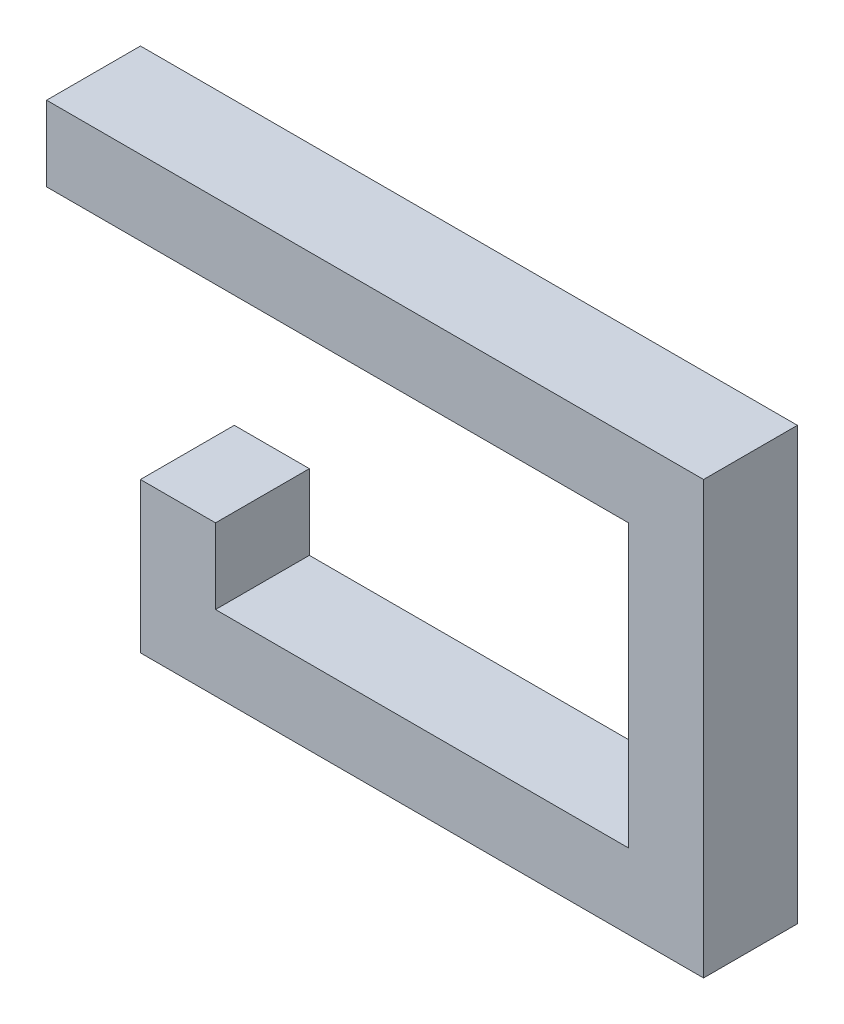
ISO-10303-21;
HEADER;
FILE_DESCRIPTION(('STEP AP214'),'2;1');
FILE_NAME('part.step','',(''),(''),'','','');
FILE_SCHEMA(('AUTOMOTIVE_DESIGN { 1 0 10303 214 1 1 1 1 }'));
ENDSEC;
DATA;
#1=APPLICATION_CONTEXT('core data for automotive mechanical design processes');
#2=APPLICATION_PROTOCOL_DEFINITION('international standard','automotive_design',2000,#1);
#3=PRODUCT_CONTEXT('',#1,'mechanical');
#4=PRODUCT('Part','Part','',(#3));
#5=PRODUCT_RELATED_PRODUCT_CATEGORY('part','',(#4));
#6=PRODUCT_DEFINITION_FORMATION('','',#4);
#7=PRODUCT_DEFINITION_CONTEXT('part definition',#1,'design');
#8=PRODUCT_DEFINITION('design','',#6,#7);
#9=PRODUCT_DEFINITION_SHAPE('','',#8);
#10=(LENGTH_UNIT() NAMED_UNIT(*) SI_UNIT(.MILLI.,.METRE.));
#11=(NAMED_UNIT(*) PLANE_ANGLE_UNIT() SI_UNIT($,.RADIAN.));
#12=(NAMED_UNIT(*) SI_UNIT($,.STERADIAN.) SOLID_ANGLE_UNIT());
#13=UNCERTAINTY_MEASURE_WITH_UNIT(LENGTH_MEASURE(1.E-05),#10,'distance_accuracy_value','');
#14=(GEOMETRIC_REPRESENTATION_CONTEXT(3) GLOBAL_UNCERTAINTY_ASSIGNED_CONTEXT((#13)) GLOBAL_UNIT_ASSIGNED_CONTEXT((#10,
#11,#12)) REPRESENTATION_CONTEXT('',''));
#15=CARTESIAN_POINT('',(0.,0.,0.));
#16=DIRECTION('',(0.,0.,1.));
#17=DIRECTION('',(1.,0.,0.));
#18=AXIS2_PLACEMENT_3D('',#15,#16,#17);
#19=CARTESIAN_POINT('',(0.,0.,2.5));
#20=DIRECTION('',(0.,1.,0.));
#21=DIRECTION('',(0.,0.,1.));
#22=AXIS2_PLACEMENT_3D('',#19,#20,#21);
#23=PLANE('',#22);
#24=DIRECTION('',(1.,0.,0.));
#25=VECTOR('',#24,1.);
#26=CARTESIAN_POINT('',(0.,0.,0.));
#27=LINE('',#26,#25);
#28=CARTESIAN_POINT('',(0.,0.,0.));
#29=VERTEX_POINT('',#28);
#30=CARTESIAN_POINT('',(15.,0.,0.));
#31=VERTEX_POINT('',#30);
#32=EDGE_CURVE('E156',#29,#31,#27,.T.);
#33=ORIENTED_EDGE('',*,*,#32,.T.);
#34=DIRECTION('',(0.,0.,-1.));
#35=VECTOR('',#34,1.);
#36=CARTESIAN_POINT('',(15.,0.,2.5));
#37=LINE('',#36,#35);
#38=CARTESIAN_POINT('',(15.,0.,2.5));
#39=VERTEX_POINT('',#38);
#40=EDGE_CURVE('E48',#39,#31,#37,.T.);
#41=ORIENTED_EDGE('',*,*,#40,.F.);
#42=DIRECTION('',(1.,0.,0.));
#43=VECTOR('',#42,1.);
#44=CARTESIAN_POINT('',(0.,0.,2.5));
#45=LINE('',#44,#43);
#46=CARTESIAN_POINT('',(0.,0.,2.5));
#47=VERTEX_POINT('',#46);
#48=EDGE_CURVE('E106',#47,#39,#45,.T.);
#49=ORIENTED_EDGE('',*,*,#48,.F.);
#50=DIRECTION('',(0.,0.,-1.));
#51=VECTOR('',#50,1.);
#52=CARTESIAN_POINT('',(0.,0.,2.5));
#53=LINE('',#52,#51);
#54=EDGE_CURVE('E11',#47,#29,#53,.T.);
#55=ORIENTED_EDGE('',*,*,#54,.T.);
#56=EDGE_LOOP('',(#33,#41,#49,#55));
#57=FACE_BOUND('',#56,.T.);
#58=ADVANCED_FACE('F39',(#57),#23,.F.);
#59=CARTESIAN_POINT('',(15.,0.,2.5));
#60=DIRECTION('',(-1.,0.,0.));
#61=DIRECTION('',(0.,0.,1.));
#62=AXIS2_PLACEMENT_3D('',#59,#60,#61);
#63=PLANE('',#62);
#64=DIRECTION('',(0.,1.,0.));
#65=VECTOR('',#64,1.);
#66=CARTESIAN_POINT('',(15.,0.,0.));
#67=LINE('',#66,#65);
#68=CARTESIAN_POINT('',(15.,11.5,0.));
#69=VERTEX_POINT('',#68);
#70=EDGE_CURVE('E159',#31,#69,#67,.T.);
#71=ORIENTED_EDGE('',*,*,#70,.T.);
#72=DIRECTION('',(0.,0.,-1.));
#73=VECTOR('',#72,1.);
#74=CARTESIAN_POINT('',(15.,11.5,2.5));
#75=LINE('',#74,#73);
#76=CARTESIAN_POINT('',(15.,11.5,2.5));
#77=VERTEX_POINT('',#76);
#78=EDGE_CURVE('E201',#77,#69,#75,.T.);
#79=ORIENTED_EDGE('',*,*,#78,.F.);
#80=DIRECTION('',(0.,1.,0.));
#81=VECTOR('',#80,1.);
#82=CARTESIAN_POINT('',(15.,0.,2.5));
#83=LINE('',#82,#81);
#84=EDGE_CURVE('E211',#39,#77,#83,.T.);
#85=ORIENTED_EDGE('',*,*,#84,.F.);
#86=ORIENTED_EDGE('',*,*,#40,.T.);
#87=EDGE_LOOP('',(#71,#79,#85,#86));
#88=FACE_BOUND('',#87,.T.);
#89=ADVANCED_FACE('F209',(#88),#63,.F.);
#90=CARTESIAN_POINT('',(15.,11.5,2.5));
#91=DIRECTION('',(0.,-1.,0.));
#92=DIRECTION('',(1.,0.,0.));
#93=AXIS2_PLACEMENT_3D('',#90,#91,#92);
#94=PLANE('',#93);
#95=DIRECTION('',(-1.,0.,0.));
#96=VECTOR('',#95,1.);
#97=CARTESIAN_POINT('',(15.,11.5,0.));
#98=LINE('',#97,#96);
#99=CARTESIAN_POINT('',(-2.5,11.5,0.));
#100=VERTEX_POINT('',#99);
#101=EDGE_CURVE('E162',#69,#100,#98,.T.);
#102=ORIENTED_EDGE('',*,*,#101,.T.);
#103=DIRECTION('',(0.,0.,-1.));
#104=VECTOR('',#103,1.);
#105=CARTESIAN_POINT('',(-2.5,11.5,2.5));
#106=LINE('',#105,#104);
#107=CARTESIAN_POINT('',(-2.5,11.5,2.5));
#108=VERTEX_POINT('',#107);
#109=EDGE_CURVE('E197',#108,#100,#106,.T.);
#110=ORIENTED_EDGE('',*,*,#109,.F.);
#111=DIRECTION('',(-1.,0.,0.));
#112=VECTOR('',#111,1.);
#113=CARTESIAN_POINT('',(15.,11.5,2.5));
#114=LINE('',#113,#112);
#115=EDGE_CURVE('E231',#77,#108,#114,.T.);
#116=ORIENTED_EDGE('',*,*,#115,.F.);
#117=ORIENTED_EDGE('',*,*,#78,.T.);
#118=EDGE_LOOP('',(#102,#110,#116,#117));
#119=FACE_BOUND('',#118,.T.);
#120=ADVANCED_FACE('F221',(#119),#94,.F.);
#121=CARTESIAN_POINT('',(-2.5,11.5,2.5));
#122=DIRECTION('',(1.,0.,0.));
#123=DIRECTION('',(0.,1.,0.));
#124=AXIS2_PLACEMENT_3D('',#121,#122,#123);
#125=PLANE('',#124);
#126=DIRECTION('',(0.,-1.,0.));
#127=VECTOR('',#126,1.);
#128=CARTESIAN_POINT('',(-2.5,11.5,0.));
#129=LINE('',#128,#127);
#130=CARTESIAN_POINT('',(-2.5,9.5,0.));
#131=VERTEX_POINT('',#130);
#132=EDGE_CURVE('E165',#100,#131,#129,.T.);
#133=ORIENTED_EDGE('',*,*,#132,.T.);
#134=DIRECTION('',(0.,0.,-1.));
#135=VECTOR('',#134,1.);
#136=CARTESIAN_POINT('',(-2.5,9.5,2.5));
#137=LINE('',#136,#135);
#138=CARTESIAN_POINT('',(-2.5,9.5,2.5));
#139=VERTEX_POINT('',#138);
#140=EDGE_CURVE('E193',#139,#131,#137,.T.);
#141=ORIENTED_EDGE('',*,*,#140,.F.);
#142=DIRECTION('',(0.,-1.,0.));
#143=VECTOR('',#142,1.);
#144=CARTESIAN_POINT('',(-2.5,11.5,2.5));
#145=LINE('',#144,#143);
#146=EDGE_CURVE('E227',#108,#139,#145,.T.);
#147=ORIENTED_EDGE('',*,*,#146,.F.);
#148=ORIENTED_EDGE('',*,*,#109,.T.);
#149=EDGE_LOOP('',(#133,#141,#147,#148));
#150=FACE_BOUND('',#149,.T.);
#151=ADVANCED_FACE('F225',(#150),#125,.F.);
#152=CARTESIAN_POINT('',(-2.5,9.5,2.5));
#153=DIRECTION('',(0.,1.,0.));
#154=DIRECTION('',(0.,0.,1.));
#155=AXIS2_PLACEMENT_3D('',#152,#153,#154);
#156=PLANE('',#155);
#157=DIRECTION('',(1.,0.,0.));
#158=VECTOR('',#157,1.);
#159=CARTESIAN_POINT('',(-2.5,9.5,0.));
#160=LINE('',#159,#158);
#161=CARTESIAN_POINT('',(13.,9.5,0.));
#162=VERTEX_POINT('',#161);
#163=EDGE_CURVE('E168',#131,#162,#160,.T.);
#164=ORIENTED_EDGE('',*,*,#163,.T.);
#165=DIRECTION('',(0.,0.,-1.));
#166=VECTOR('',#165,1.);
#167=CARTESIAN_POINT('',(13.,9.5,2.5));
#168=LINE('',#167,#166);
#169=CARTESIAN_POINT('',(13.,9.5,2.5));
#170=VERTEX_POINT('',#169);
#171=EDGE_CURVE('E189',#170,#162,#168,.T.);
#172=ORIENTED_EDGE('',*,*,#171,.F.);
#173=DIRECTION('',(1.,0.,0.));
#174=VECTOR('',#173,1.);
#175=CARTESIAN_POINT('',(-2.5,9.5,2.5));
#176=LINE('',#175,#174);
#177=EDGE_CURVE('E230',#139,#170,#176,.T.);
#178=ORIENTED_EDGE('',*,*,#177,.F.);
#179=ORIENTED_EDGE('',*,*,#140,.T.);
#180=EDGE_LOOP('',(#164,#172,#178,#179));
#181=FACE_BOUND('',#180,.T.);
#182=ADVANCED_FACE('F256',(#181),#156,.F.);
#183=CARTESIAN_POINT('',(13.,9.5,2.5));
#184=DIRECTION('',(1.,0.,0.));
#185=DIRECTION('',(0.,1.,0.));
#186=AXIS2_PLACEMENT_3D('',#183,#184,#185);
#187=PLANE('',#186);
#188=DIRECTION('',(0.,-1.,0.));
#189=VECTOR('',#188,1.);
#190=CARTESIAN_POINT('',(13.,9.5,0.));
#191=LINE('',#190,#189);
#192=CARTESIAN_POINT('',(13.,2.,0.));
#193=VERTEX_POINT('',#192);
#194=EDGE_CURVE('E171',#162,#193,#191,.T.);
#195=ORIENTED_EDGE('',*,*,#194,.T.);
#196=DIRECTION('',(0.,0.,-1.));
#197=VECTOR('',#196,1.);
#198=CARTESIAN_POINT('',(13.,2.,2.5));
#199=LINE('',#198,#197);
#200=CARTESIAN_POINT('',(13.,2.,2.5));
#201=VERTEX_POINT('',#200);
#202=EDGE_CURVE('E143',#201,#193,#199,.T.);
#203=ORIENTED_EDGE('',*,*,#202,.F.);
#204=DIRECTION('',(0.,-1.,0.));
#205=VECTOR('',#204,1.);
#206=CARTESIAN_POINT('',(13.,9.5,2.5));
#207=LINE('',#206,#205);
#208=EDGE_CURVE('E132',#170,#201,#207,.T.);
#209=ORIENTED_EDGE('',*,*,#208,.F.);
#210=ORIENTED_EDGE('',*,*,#171,.T.);
#211=EDGE_LOOP('',(#195,#203,#209,#210));
#212=FACE_BOUND('',#211,.T.);
#213=ADVANCED_FACE('F259',(#212),#187,.F.);
#214=CARTESIAN_POINT('',(13.,2.,2.5));
#215=DIRECTION('',(0.,-1.,0.));
#216=DIRECTION('',(1.,0.,0.));
#217=AXIS2_PLACEMENT_3D('',#214,#215,#216);
#218=PLANE('',#217);
#219=DIRECTION('',(-1.,0.,0.));
#220=VECTOR('',#219,1.);
#221=CARTESIAN_POINT('',(13.,2.,0.));
#222=LINE('',#221,#220);
#223=CARTESIAN_POINT('',(2.,2.,0.));
#224=VERTEX_POINT('',#223);
#225=EDGE_CURVE('E141',#193,#224,#222,.T.);
#226=ORIENTED_EDGE('',*,*,#225,.T.);
#227=DIRECTION('',(0.,0.,-1.));
#228=VECTOR('',#227,1.);
#229=CARTESIAN_POINT('',(2.,2.,2.5));
#230=LINE('',#229,#228);
#231=CARTESIAN_POINT('',(2.,2.,2.5));
#232=VERTEX_POINT('',#231);
#233=EDGE_CURVE('E138',#232,#224,#230,.T.);
#234=ORIENTED_EDGE('',*,*,#233,.F.);
#235=DIRECTION('',(-1.,0.,0.));
#236=VECTOR('',#235,1.);
#237=CARTESIAN_POINT('',(13.,2.,2.5));
#238=LINE('',#237,#236);
#239=EDGE_CURVE('E126',#201,#232,#238,.T.);
#240=ORIENTED_EDGE('',*,*,#239,.F.);
#241=ORIENTED_EDGE('',*,*,#202,.T.);
#242=EDGE_LOOP('',(#226,#234,#240,#241));
#243=FACE_BOUND('',#242,.T.);
#244=ADVANCED_FACE('F139',(#243),#218,.F.);
#245=CARTESIAN_POINT('',(2.,2.,2.5));
#246=DIRECTION('',(-1.,0.,0.));
#247=DIRECTION('',(0.,0.,1.));
#248=AXIS2_PLACEMENT_3D('',#245,#246,#247);
#249=PLANE('',#248);
#250=DIRECTION('',(0.,1.,0.));
#251=VECTOR('',#250,1.);
#252=CARTESIAN_POINT('',(2.,2.,0.));
#253=LINE('',#252,#251);
#254=CARTESIAN_POINT('',(2.,4.,0.));
#255=VERTEX_POINT('',#254);
#256=EDGE_CURVE('E92',#224,#255,#253,.T.);
#257=ORIENTED_EDGE('',*,*,#256,.T.);
#258=DIRECTION('',(0.,0.,-1.));
#259=VECTOR('',#258,1.);
#260=CARTESIAN_POINT('',(2.,4.,2.5));
#261=LINE('',#260,#259);
#262=CARTESIAN_POINT('',(2.,4.,2.5));
#263=VERTEX_POINT('',#262);
#264=EDGE_CURVE('E144',#263,#255,#261,.T.);
#265=ORIENTED_EDGE('',*,*,#264,.F.);
#266=DIRECTION('',(0.,1.,0.));
#267=VECTOR('',#266,1.);
#268=CARTESIAN_POINT('',(2.,2.,2.5));
#269=LINE('',#268,#267);
#270=EDGE_CURVE('E130',#232,#263,#269,.T.);
#271=ORIENTED_EDGE('',*,*,#270,.F.);
#272=ORIENTED_EDGE('',*,*,#233,.T.);
#273=EDGE_LOOP('',(#257,#265,#271,#272));
#274=FACE_BOUND('',#273,.T.);
#275=ADVANCED_FACE('F146',(#274),#249,.F.);
#276=CARTESIAN_POINT('',(2.,4.,2.5));
#277=DIRECTION('',(0.,-1.,0.));
#278=DIRECTION('',(0.,0.,-1.));
#279=AXIS2_PLACEMENT_3D('',#276,#277,#278);
#280=PLANE('',#279);
#281=DIRECTION('',(-1.,0.,0.));
#282=VECTOR('',#281,1.);
#283=CARTESIAN_POINT('',(2.,4.,0.));
#284=LINE('',#283,#282);
#285=CARTESIAN_POINT('',(0.,4.,0.));
#286=VERTEX_POINT('',#285);
#287=EDGE_CURVE('E99',#255,#286,#284,.T.);
#288=ORIENTED_EDGE('',*,*,#287,.T.);
#289=DIRECTION('',(0.,0.,-1.));
#290=VECTOR('',#289,1.);
#291=CARTESIAN_POINT('',(0.,4.,2.5));
#292=LINE('',#291,#290);
#293=CARTESIAN_POINT('',(0.,4.,2.5));
#294=VERTEX_POINT('',#293);
#295=EDGE_CURVE('E152',#294,#286,#292,.T.);
#296=ORIENTED_EDGE('',*,*,#295,.F.);
#297=DIRECTION('',(-1.,0.,0.));
#298=VECTOR('',#297,1.);
#299=CARTESIAN_POINT('',(2.,4.,2.5));
#300=LINE('',#299,#298);
#301=EDGE_CURVE('E149',#263,#294,#300,.T.);
#302=ORIENTED_EDGE('',*,*,#301,.F.);
#303=ORIENTED_EDGE('',*,*,#264,.T.);
#304=EDGE_LOOP('',(#288,#296,#302,#303));
#305=FACE_BOUND('',#304,.T.);
#306=ADVANCED_FACE('F268',(#305),#280,.F.);
#307=CARTESIAN_POINT('',(0.,4.,2.5));
#308=DIRECTION('',(1.,0.,0.));
#309=DIRECTION('',(0.,1.,0.));
#310=AXIS2_PLACEMENT_3D('',#307,#308,#309);
#311=PLANE('',#310);
#312=DIRECTION('',(0.,-1.,0.));
#313=VECTOR('',#312,1.);
#314=CARTESIAN_POINT('',(0.,4.,0.));
#315=LINE('',#314,#313);
#316=EDGE_CURVE('E180',#286,#29,#315,.T.);
#317=ORIENTED_EDGE('',*,*,#316,.T.);
#318=ORIENTED_EDGE('',*,*,#54,.F.);
#319=DIRECTION('',(0.,-1.,0.));
#320=VECTOR('',#319,1.);
#321=CARTESIAN_POINT('',(0.,2.,2.5));
#322=LINE('',#321,#320);
#323=EDGE_CURVE('E56',#294,#47,#322,.T.);
#324=ORIENTED_EDGE('',*,*,#323,.F.);
#325=ORIENTED_EDGE('',*,*,#295,.T.);
#326=EDGE_LOOP('',(#317,#318,#324,#325));
#327=FACE_BOUND('',#326,.T.);
#328=ADVANCED_FACE('F244',(#327),#311,.F.);
#329=CARTESIAN_POINT('',(0.,0.,2.5));
#330=DIRECTION('',(0.,0.,1.));
#331=DIRECTION('',(1.,0.,0.));
#332=AXIS2_PLACEMENT_3D('',#329,#330,#331);
#333=PLANE('',#332);
#334=ORIENTED_EDGE('',*,*,#323,.T.);
#335=ORIENTED_EDGE('',*,*,#48,.T.);
#336=ORIENTED_EDGE('',*,*,#84,.T.);
#337=ORIENTED_EDGE('',*,*,#115,.T.);
#338=ORIENTED_EDGE('',*,*,#146,.T.);
#339=ORIENTED_EDGE('',*,*,#177,.T.);
#340=ORIENTED_EDGE('',*,*,#208,.T.);
#341=ORIENTED_EDGE('',*,*,#239,.T.);
#342=ORIENTED_EDGE('',*,*,#270,.T.);
#343=ORIENTED_EDGE('',*,*,#301,.T.);
#344=EDGE_LOOP('',(#334,#335,#336,#337,#338,#339,#340,#341,#342,#343));
#345=FACE_BOUND('',#344,.T.);
#346=ADVANCED_FACE('F128',(#345),#333,.T.);
#347=CARTESIAN_POINT('',(0.,0.,0.));
#348=DIRECTION('',(0.,0.,1.));
#349=DIRECTION('',(1.,0.,0.));
#350=AXIS2_PLACEMENT_3D('',#347,#348,#349);
#351=PLANE('',#350);
#352=ORIENTED_EDGE('',*,*,#32,.F.);
#353=ORIENTED_EDGE('',*,*,#316,.F.);
#354=ORIENTED_EDGE('',*,*,#287,.F.);
#355=ORIENTED_EDGE('',*,*,#256,.F.);
#356=ORIENTED_EDGE('',*,*,#225,.F.);
#357=ORIENTED_EDGE('',*,*,#194,.F.);
#358=ORIENTED_EDGE('',*,*,#163,.F.);
#359=ORIENTED_EDGE('',*,*,#132,.F.);
#360=ORIENTED_EDGE('',*,*,#101,.F.);
#361=ORIENTED_EDGE('',*,*,#70,.F.);
#362=EDGE_LOOP('',(#352,#353,#354,#355,#356,#357,#358,#359,#360,#361));
#363=FACE_BOUND('',#362,.T.);
#364=ADVANCED_FACE('F215',(#363),#351,.F.);
#365=CLOSED_SHELL('',(#58,#89,#120,#151,#182,#213,#244,#275,#306,#328,#346,#364));
#366=MANIFOLD_SOLID_BREP('B2',#365);
#367=ADVANCED_BREP_SHAPE_REPRESENTATION('',(#18,#366),#14);
#368=SHAPE_DEFINITION_REPRESENTATION(#9,#367);
ENDSEC;
END-ISO-10303-21;
